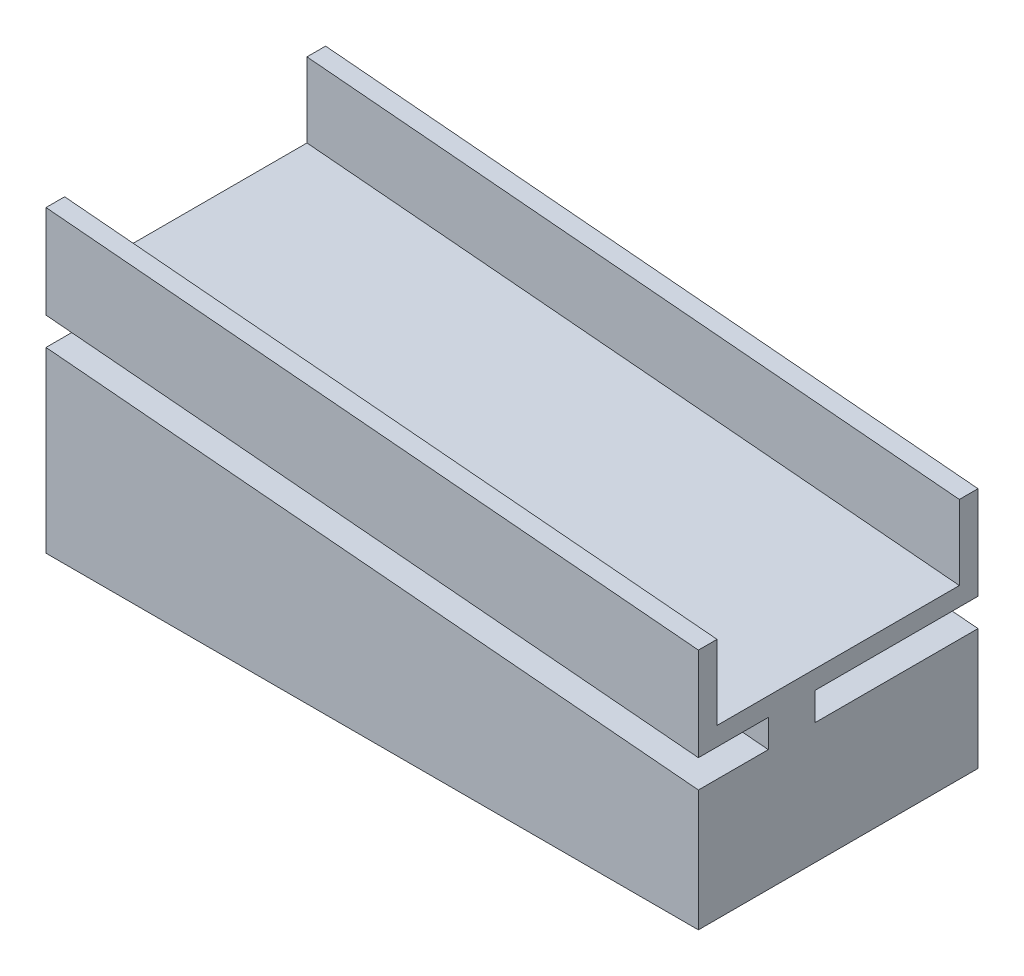
ISO-10303-21;
HEADER;
FILE_DESCRIPTION(('STEP AP214'),'2;1');
FILE_NAME('part.step','',(''),(''),'','','');
FILE_SCHEMA(('AUTOMOTIVE_DESIGN { 1 0 10303 214 1 1 1 1 }'));
ENDSEC;
DATA;
#1=APPLICATION_CONTEXT('core data for automotive mechanical design processes');
#2=APPLICATION_PROTOCOL_DEFINITION('international standard','automotive_design',2000,#1);
#3=PRODUCT_CONTEXT('',#1,'mechanical');
#4=PRODUCT('Part','Part','',(#3));
#5=PRODUCT_RELATED_PRODUCT_CATEGORY('part','',(#4));
#6=PRODUCT_DEFINITION_FORMATION('','',#4);
#7=PRODUCT_DEFINITION_CONTEXT('part definition',#1,'design');
#8=PRODUCT_DEFINITION('design','',#6,#7);
#9=PRODUCT_DEFINITION_SHAPE('','',#8);
#10=(LENGTH_UNIT() NAMED_UNIT(*) SI_UNIT(.MILLI.,.METRE.));
#11=(NAMED_UNIT(*) PLANE_ANGLE_UNIT() SI_UNIT($,.RADIAN.));
#12=(NAMED_UNIT(*) SI_UNIT($,.STERADIAN.) SOLID_ANGLE_UNIT());
#13=UNCERTAINTY_MEASURE_WITH_UNIT(LENGTH_MEASURE(1.E-05),#10,'distance_accuracy_value','');
#14=(GEOMETRIC_REPRESENTATION_CONTEXT(3) GLOBAL_UNCERTAINTY_ASSIGNED_CONTEXT((#13)) GLOBAL_UNIT_ASSIGNED_CONTEXT((#10,
#11,#12)) REPRESENTATION_CONTEXT('',''));
#15=CARTESIAN_POINT('',(0.,0.,0.));
#16=DIRECTION('',(0.,0.,1.));
#17=DIRECTION('',(1.,0.,0.));
#18=AXIS2_PLACEMENT_3D('',#15,#16,#17);
#19=CARTESIAN_POINT('',(0.,19.1242064468142,30.));
#20=DIRECTION('',(-0.0871557427476511,-0.996194698091746,0.));
#21=DIRECTION('',(0.996194698091746,-0.0871557427476511,0.));
#22=AXIS2_PLACEMENT_3D('',#19,#20,#21);
#23=PLANE('',#22);
#24=DIRECTION('',(0.996194698091746,-0.0871557427476511,0.));
#25=VECTOR('',#24,1.);
#26=CARTESIAN_POINT('',(0.,19.1242064468142,17.5));
#27=LINE('',#26,#25);
#28=CARTESIAN_POINT('',(0.,19.1242064468142,17.5));
#29=VERTEX_POINT('',#28);
#30=CARTESIAN_POINT('',(70.,13.,17.5));
#31=VERTEX_POINT('',#30);
#32=EDGE_CURVE('E242',#29,#31,#27,.T.);
#33=ORIENTED_EDGE('',*,*,#32,.T.);
#34=DIRECTION('',(0.,0.,-1.));
#35=VECTOR('',#34,1.);
#36=CARTESIAN_POINT('',(70.,13.,30.));
#37=LINE('',#36,#35);
#38=CARTESIAN_POINT('',(70.,13.,0.));
#39=VERTEX_POINT('',#38);
#40=EDGE_CURVE('E268',#31,#39,#37,.T.);
#41=ORIENTED_EDGE('',*,*,#40,.T.);
#42=DIRECTION('',(-0.996194698091746,0.0871557427476511,0.));
#43=VECTOR('',#42,1.);
#44=CARTESIAN_POINT('',(0.,19.1242064468142,0.));
#45=LINE('',#44,#43);
#46=CARTESIAN_POINT('',(0.,19.1242064468142,0.));
#47=VERTEX_POINT('',#46);
#48=EDGE_CURVE('E261',#39,#47,#45,.T.);
#49=ORIENTED_EDGE('',*,*,#48,.T.);
#50=DIRECTION('',(0.,0.,-1.));
#51=VECTOR('',#50,1.);
#52=CARTESIAN_POINT('',(0.,19.1242064468142,30.));
#53=LINE('',#52,#51);
#54=EDGE_CURVE('E266',#29,#47,#53,.T.);
#55=ORIENTED_EDGE('',*,*,#54,.F.);
#56=EDGE_LOOP('',(#33,#41,#49,#55));
#57=FACE_BOUND('',#56,.T.);
#58=ADVANCED_FACE('F33',(#57),#23,.F.);
#59=CARTESIAN_POINT('',(70.,0.,30.));
#60=DIRECTION('',(0.,1.,0.));
#61=DIRECTION('',(-1.,0.,0.));
#62=AXIS2_PLACEMENT_3D('',#59,#60,#61);
#63=PLANE('',#62);
#64=DIRECTION('',(1.,0.,0.));
#65=VECTOR('',#64,1.);
#66=CARTESIAN_POINT('',(70.,0.,0.));
#67=LINE('',#66,#65);
#68=CARTESIAN_POINT('',(0.,0.,0.));
#69=VERTEX_POINT('',#68);
#70=CARTESIAN_POINT('',(70.,0.,0.));
#71=VERTEX_POINT('',#70);
#72=EDGE_CURVE('E240',#69,#71,#67,.T.);
#73=ORIENTED_EDGE('',*,*,#72,.T.);
#74=DIRECTION('',(0.,0.,-1.));
#75=VECTOR('',#74,1.);
#76=CARTESIAN_POINT('',(70.,0.,30.));
#77=LINE('',#76,#75);
#78=CARTESIAN_POINT('',(70.,0.,30.));
#79=VERTEX_POINT('',#78);
#80=EDGE_CURVE('E11',#79,#71,#77,.T.);
#81=ORIENTED_EDGE('',*,*,#80,.F.);
#82=DIRECTION('',(1.,0.,0.));
#83=VECTOR('',#82,1.);
#84=CARTESIAN_POINT('',(70.,0.,30.));
#85=LINE('',#84,#83);
#86=CARTESIAN_POINT('',(0.,0.,30.));
#87=VERTEX_POINT('',#86);
#88=EDGE_CURVE('E249',#87,#79,#85,.T.);
#89=ORIENTED_EDGE('',*,*,#88,.F.);
#90=DIRECTION('',(0.,0.,-1.));
#91=VECTOR('',#90,1.);
#92=CARTESIAN_POINT('',(0.,0.,30.));
#93=LINE('',#92,#91);
#94=EDGE_CURVE('E255',#87,#69,#93,.T.);
#95=ORIENTED_EDGE('',*,*,#94,.T.);
#96=EDGE_LOOP('',(#73,#81,#89,#95));
#97=FACE_BOUND('',#96,.T.);
#98=ADVANCED_FACE('F35',(#97),#63,.F.);
#99=CARTESIAN_POINT('',(70.,13.,30.));
#100=DIRECTION('',(-1.,0.,0.));
#101=DIRECTION('',(0.,0.,1.));
#102=AXIS2_PLACEMENT_3D('',#99,#100,#101);
#103=PLANE('',#102);
#104=DIRECTION('',(0.,1.,0.));
#105=VECTOR('',#104,1.);
#106=CARTESIAN_POINT('',(70.,13.,0.));
#107=LINE('',#106,#105);
#108=EDGE_CURVE('E258',#71,#39,#107,.T.);
#109=ORIENTED_EDGE('',*,*,#108,.T.);
#110=ORIENTED_EDGE('',*,*,#40,.F.);
#111=DIRECTION('',(0.,1.,0.));
#112=VECTOR('',#111,1.);
#113=CARTESIAN_POINT('',(70.,13.,17.5));
#114=LINE('',#113,#112);
#115=CARTESIAN_POINT('',(70.,16.,17.5));
#116=VERTEX_POINT('',#115);
#117=EDGE_CURVE('E245',#31,#116,#114,.T.);
#118=ORIENTED_EDGE('',*,*,#117,.T.);
#119=DIRECTION('',(0.,0.,1.));
#120=VECTOR('',#119,1.);
#121=CARTESIAN_POINT('',(70.,16.,0.));
#122=LINE('',#121,#120);
#123=CARTESIAN_POINT('',(70.,16.,0.));
#124=VERTEX_POINT('',#123);
#125=EDGE_CURVE('E229',#124,#116,#122,.T.);
#126=ORIENTED_EDGE('',*,*,#125,.F.);
#127=DIRECTION('',(0.,-1.,0.));
#128=VECTOR('',#127,1.);
#129=CARTESIAN_POINT('',(70.,16.,0.));
#130=LINE('',#129,#128);
#131=CARTESIAN_POINT('',(70.,26.,0.));
#132=VERTEX_POINT('',#131);
#133=EDGE_CURVE('E222',#132,#124,#130,.T.);
#134=ORIENTED_EDGE('',*,*,#133,.F.);
#135=DIRECTION('',(0.,0.,-1.));
#136=VECTOR('',#135,1.);
#137=CARTESIAN_POINT('',(70.,26.,0.));
#138=LINE('',#137,#136);
#139=CARTESIAN_POINT('',(70.,26.,2.));
#140=VERTEX_POINT('',#139);
#141=EDGE_CURVE('E215',#140,#132,#138,.T.);
#142=ORIENTED_EDGE('',*,*,#141,.F.);
#143=DIRECTION('',(0.,1.,0.));
#144=VECTOR('',#143,1.);
#145=CARTESIAN_POINT('',(70.,26.,2.));
#146=LINE('',#145,#144);
#147=CARTESIAN_POINT('',(70.,18.,2.));
#148=VERTEX_POINT('',#147);
#149=EDGE_CURVE('E207',#148,#140,#146,.T.);
#150=ORIENTED_EDGE('',*,*,#149,.F.);
#151=DIRECTION('',(0.,0.,-1.));
#152=VECTOR('',#151,1.);
#153=CARTESIAN_POINT('',(70.,18.,2.));
#154=LINE('',#153,#152);
#155=CARTESIAN_POINT('',(70.,18.,28.));
#156=VERTEX_POINT('',#155);
#157=EDGE_CURVE('E199',#156,#148,#154,.T.);
#158=ORIENTED_EDGE('',*,*,#157,.F.);
#159=DIRECTION('',(0.,-1.,0.));
#160=VECTOR('',#159,1.);
#161=CARTESIAN_POINT('',(70.,26.,28.));
#162=LINE('',#161,#160);
#163=CARTESIAN_POINT('',(70.,26.,28.));
#164=VERTEX_POINT('',#163);
#165=EDGE_CURVE('E191',#164,#156,#162,.T.);
#166=ORIENTED_EDGE('',*,*,#165,.F.);
#167=DIRECTION('',(0.,0.,-1.));
#168=VECTOR('',#167,1.);
#169=CARTESIAN_POINT('',(70.,26.,28.));
#170=LINE('',#169,#168);
#171=CARTESIAN_POINT('',(70.,26.,30.));
#172=VERTEX_POINT('',#171);
#173=EDGE_CURVE('E186',#172,#164,#170,.T.);
#174=ORIENTED_EDGE('',*,*,#173,.F.);
#175=DIRECTION('',(0.,1.,0.));
#176=VECTOR('',#175,1.);
#177=CARTESIAN_POINT('',(70.,16.,30.));
#178=LINE('',#177,#176);
#179=CARTESIAN_POINT('',(70.,16.,30.));
#180=VERTEX_POINT('',#179);
#181=EDGE_CURVE('E179',#180,#172,#178,.T.);
#182=ORIENTED_EDGE('',*,*,#181,.F.);
#183=CARTESIAN_POINT('',(70.,16.,22.5));
#184=VERTEX_POINT('',#183);
#185=EDGE_CURVE('E177',#184,#180,#122,.T.);
#186=ORIENTED_EDGE('',*,*,#185,.F.);
#187=DIRECTION('',(0.,1.,0.));
#188=VECTOR('',#187,1.);
#189=CARTESIAN_POINT('',(70.,13.,22.5));
#190=LINE('',#189,#188);
#191=CARTESIAN_POINT('',(70.,13.,22.5));
#192=VERTEX_POINT('',#191);
#193=EDGE_CURVE('E235',#192,#184,#190,.T.);
#194=ORIENTED_EDGE('',*,*,#193,.F.);
#195=CARTESIAN_POINT('',(70.,13.,30.));
#196=VERTEX_POINT('',#195);
#197=EDGE_CURVE('E41',#196,#192,#37,.T.);
#198=ORIENTED_EDGE('',*,*,#197,.F.);
#199=DIRECTION('',(0.,1.,0.));
#200=VECTOR('',#199,1.);
#201=CARTESIAN_POINT('',(70.,13.,30.));
#202=LINE('',#201,#200);
#203=EDGE_CURVE('E82',#79,#196,#202,.T.);
#204=ORIENTED_EDGE('',*,*,#203,.F.);
#205=ORIENTED_EDGE('',*,*,#80,.T.);
#206=EDGE_LOOP('',(#109,#110,#118,#126,#134,#142,#150,#158,#166,#174,#182,#186,#194,#198,#204,#205));
#207=FACE_BOUND('',#206,.T.);
#208=ADVANCED_FACE('F277',(#207),#103,.F.);
#209=ORIENTED_EDGE('',*,*,#197,.T.);
#210=DIRECTION('',(0.996194698091746,-0.0871557427476511,0.));
#211=VECTOR('',#210,1.);
#212=CARTESIAN_POINT('',(0.,19.1242064468142,22.5));
#213=LINE('',#212,#211);
#214=CARTESIAN_POINT('',(0.,19.1242064468142,22.5));
#215=VERTEX_POINT('',#214);
#216=EDGE_CURVE('E232',#215,#192,#213,.T.);
#217=ORIENTED_EDGE('',*,*,#216,.F.);
#218=CARTESIAN_POINT('',(0.,19.1242064468142,30.));
#219=VERTEX_POINT('',#218);
#220=EDGE_CURVE('E267',#219,#215,#53,.T.);
#221=ORIENTED_EDGE('',*,*,#220,.F.);
#222=DIRECTION('',(-0.996194698091746,0.0871557427476511,0.));
#223=VECTOR('',#222,1.);
#224=CARTESIAN_POINT('',(0.,19.1242064468142,30.));
#225=LINE('',#224,#223);
#226=EDGE_CURVE('E252',#196,#219,#225,.T.);
#227=ORIENTED_EDGE('',*,*,#226,.F.);
#228=EDGE_LOOP('',(#209,#217,#221,#227));
#229=FACE_BOUND('',#228,.T.);
#230=ADVANCED_FACE('F285',(#229),#23,.F.);
#231=CARTESIAN_POINT('',(0.,0.,30.));
#232=DIRECTION('',(1.,0.,0.));
#233=DIRECTION('',(0.,1.,0.));
#234=AXIS2_PLACEMENT_3D('',#231,#232,#233);
#235=PLANE('',#234);
#236=DIRECTION('',(0.,-1.,0.));
#237=VECTOR('',#236,1.);
#238=CARTESIAN_POINT('',(0.,0.,0.));
#239=LINE('',#238,#237);
#240=EDGE_CURVE('E75',#47,#69,#239,.T.);
#241=ORIENTED_EDGE('',*,*,#240,.T.);
#242=ORIENTED_EDGE('',*,*,#94,.F.);
#243=DIRECTION('',(0.,-1.,0.));
#244=VECTOR('',#243,1.);
#245=CARTESIAN_POINT('',(0.,0.,30.));
#246=LINE('',#245,#244);
#247=EDGE_CURVE('E57',#219,#87,#246,.T.);
#248=ORIENTED_EDGE('',*,*,#247,.F.);
#249=ORIENTED_EDGE('',*,*,#220,.T.);
#250=DIRECTION('',(0.,-1.,0.));
#251=VECTOR('',#250,1.);
#252=CARTESIAN_POINT('',(0.,22.1242064468142,22.5));
#253=LINE('',#252,#251);
#254=CARTESIAN_POINT('',(0.,22.1242064468142,22.5));
#255=VERTEX_POINT('',#254);
#256=EDGE_CURVE('E160',#255,#215,#253,.T.);
#257=ORIENTED_EDGE('',*,*,#256,.F.);
#258=DIRECTION('',(0.,0.,1.));
#259=VECTOR('',#258,1.);
#260=CARTESIAN_POINT('',(0.,22.1242064468142,0.));
#261=LINE('',#260,#259);
#262=CARTESIAN_POINT('',(0.,22.1242064468142,30.));
#263=VERTEX_POINT('',#262);
#264=EDGE_CURVE('E153',#255,#263,#261,.T.);
#265=ORIENTED_EDGE('',*,*,#264,.T.);
#266=DIRECTION('',(0.,1.,0.));
#267=VECTOR('',#266,1.);
#268=CARTESIAN_POINT('',(0.,22.1242064468142,30.));
#269=LINE('',#268,#267);
#270=CARTESIAN_POINT('',(0.,32.1242064468142,30.));
#271=VERTEX_POINT('',#270);
#272=EDGE_CURVE('E157',#263,#271,#269,.T.);
#273=ORIENTED_EDGE('',*,*,#272,.T.);
#274=DIRECTION('',(0.,0.,-1.));
#275=VECTOR('',#274,1.);
#276=CARTESIAN_POINT('',(0.,32.1242064468142,28.));
#277=LINE('',#276,#275);
#278=CARTESIAN_POINT('',(0.,32.1242064468142,28.));
#279=VERTEX_POINT('',#278);
#280=EDGE_CURVE('E173',#271,#279,#277,.T.);
#281=ORIENTED_EDGE('',*,*,#280,.T.);
#282=DIRECTION('',(0.,-1.,0.));
#283=VECTOR('',#282,1.);
#284=CARTESIAN_POINT('',(0.,32.1242064468142,28.));
#285=LINE('',#284,#283);
#286=CARTESIAN_POINT('',(0.,24.1242064468142,28.));
#287=VERTEX_POINT('',#286);
#288=EDGE_CURVE('E185',#279,#287,#285,.T.);
#289=ORIENTED_EDGE('',*,*,#288,.T.);
#290=DIRECTION('',(0.,0.,-1.));
#291=VECTOR('',#290,1.);
#292=CARTESIAN_POINT('',(0.,24.1242064468142,2.));
#293=LINE('',#292,#291);
#294=CARTESIAN_POINT('',(0.,24.1242064468142,2.));
#295=VERTEX_POINT('',#294);
#296=EDGE_CURVE('E194',#287,#295,#293,.T.);
#297=ORIENTED_EDGE('',*,*,#296,.T.);
#298=DIRECTION('',(0.,1.,0.));
#299=VECTOR('',#298,1.);
#300=CARTESIAN_POINT('',(0.,32.1242064468142,2.));
#301=LINE('',#300,#299);
#302=CARTESIAN_POINT('',(0.,32.1242064468142,2.));
#303=VERTEX_POINT('',#302);
#304=EDGE_CURVE('E202',#295,#303,#301,.T.);
#305=ORIENTED_EDGE('',*,*,#304,.T.);
#306=DIRECTION('',(0.,0.,-1.));
#307=VECTOR('',#306,1.);
#308=CARTESIAN_POINT('',(0.,32.1242064468142,0.));
#309=LINE('',#308,#307);
#310=CARTESIAN_POINT('',(0.,32.1242064468142,0.));
#311=VERTEX_POINT('',#310);
#312=EDGE_CURVE('E210',#303,#311,#309,.T.);
#313=ORIENTED_EDGE('',*,*,#312,.T.);
#314=DIRECTION('',(0.,-1.,0.));
#315=VECTOR('',#314,1.);
#316=CARTESIAN_POINT('',(0.,22.1242064468142,0.));
#317=LINE('',#316,#315);
#318=CARTESIAN_POINT('',(0.,22.1242064468142,0.));
#319=VERTEX_POINT('',#318);
#320=EDGE_CURVE('E165',#311,#319,#317,.T.);
#321=ORIENTED_EDGE('',*,*,#320,.T.);
#322=CARTESIAN_POINT('',(0.,22.1242064468142,17.5));
#323=VERTEX_POINT('',#322);
#324=EDGE_CURVE('E164',#319,#323,#261,.T.);
#325=ORIENTED_EDGE('',*,*,#324,.T.);
#326=DIRECTION('',(0.,-1.,0.));
#327=VECTOR('',#326,1.);
#328=CARTESIAN_POINT('',(0.,22.1242064468142,17.5));
#329=LINE('',#328,#327);
#330=EDGE_CURVE('E48',#323,#29,#329,.T.);
#331=ORIENTED_EDGE('',*,*,#330,.T.);
#332=ORIENTED_EDGE('',*,*,#54,.T.);
#333=EDGE_LOOP('',(#241,#242,#248,#249,#257,#265,#273,#281,#289,#297,#305,#313,#321,#325,#331,#332));
#334=FACE_BOUND('',#333,.T.);
#335=ADVANCED_FACE('F155',(#334),#235,.F.);
#336=CARTESIAN_POINT('',(0.,0.,30.));
#337=DIRECTION('',(0.,0.,-1.));
#338=DIRECTION('',(-1.,0.,0.));
#339=AXIS2_PLACEMENT_3D('',#336,#337,#338);
#340=PLANE('',#339);
#341=ORIENTED_EDGE('',*,*,#88,.T.);
#342=ORIENTED_EDGE('',*,*,#203,.T.);
#343=ORIENTED_EDGE('',*,*,#226,.T.);
#344=ORIENTED_EDGE('',*,*,#247,.T.);
#345=EDGE_LOOP('',(#341,#342,#343,#344));
#346=FACE_BOUND('',#345,.T.);
#347=ADVANCED_FACE('F339',(#346),#340,.F.);
#348=CARTESIAN_POINT('',(0.,0.,0.));
#349=DIRECTION('',(0.,0.,-1.));
#350=DIRECTION('',(-1.,0.,0.));
#351=AXIS2_PLACEMENT_3D('',#348,#349,#350);
#352=PLANE('',#351);
#353=ORIENTED_EDGE('',*,*,#72,.F.);
#354=ORIENTED_EDGE('',*,*,#240,.F.);
#355=ORIENTED_EDGE('',*,*,#48,.F.);
#356=ORIENTED_EDGE('',*,*,#108,.F.);
#357=EDGE_LOOP('',(#353,#354,#355,#356));
#358=FACE_BOUND('',#357,.T.);
#359=ADVANCED_FACE('F281',(#358),#352,.T.);
#360=CARTESIAN_POINT('',(0.,0.,22.5));
#361=DIRECTION('',(0.,0.,1.));
#362=DIRECTION('',(1.,0.,0.));
#363=AXIS2_PLACEMENT_3D('',#360,#361,#362);
#364=PLANE('',#363);
#365=ORIENTED_EDGE('',*,*,#256,.T.);
#366=ORIENTED_EDGE('',*,*,#216,.T.);
#367=ORIENTED_EDGE('',*,*,#193,.T.);
#368=DIRECTION('',(-0.996194698091746,0.087155742747651,0.));
#369=VECTOR('',#368,1.);
#370=CARTESIAN_POINT('',(70.,16.,22.5));
#371=LINE('',#370,#369);
#372=EDGE_CURVE('E238',#184,#255,#371,.T.);
#373=ORIENTED_EDGE('',*,*,#372,.T.);
#374=EDGE_LOOP('',(#365,#366,#367,#373));
#375=FACE_BOUND('',#374,.T.);
#376=ADVANCED_FACE('F288',(#375),#364,.T.);
#377=CARTESIAN_POINT('',(0.,0.,17.5));
#378=DIRECTION('',(0.,0.,1.));
#379=DIRECTION('',(1.,0.,0.));
#380=AXIS2_PLACEMENT_3D('',#377,#378,#379);
#381=PLANE('',#380);
#382=ORIENTED_EDGE('',*,*,#330,.F.);
#383=DIRECTION('',(-0.996194698091746,0.087155742747651,0.));
#384=VECTOR('',#383,1.);
#385=CARTESIAN_POINT('',(70.,16.,17.5));
#386=LINE('',#385,#384);
#387=EDGE_CURVE('E233',#116,#323,#386,.T.);
#388=ORIENTED_EDGE('',*,*,#387,.F.);
#389=ORIENTED_EDGE('',*,*,#117,.F.);
#390=ORIENTED_EDGE('',*,*,#32,.F.);
#391=EDGE_LOOP('',(#382,#388,#389,#390));
#392=FACE_BOUND('',#391,.T.);
#393=ADVANCED_FACE('F318',(#392),#381,.F.);
#394=CARTESIAN_POINT('',(0.,22.1242064468142,0.));
#395=DIRECTION('',(0.087155742747651,0.996194698091746,0.));
#396=DIRECTION('',(-0.996194698091746,0.087155742747651,0.));
#397=AXIS2_PLACEMENT_3D('',#394,#395,#396);
#398=PLANE('',#397);
#399=ORIENTED_EDGE('',*,*,#125,.T.);
#400=ORIENTED_EDGE('',*,*,#387,.T.);
#401=ORIENTED_EDGE('',*,*,#324,.F.);
#402=DIRECTION('',(0.996194698091746,-0.087155742747651,0.));
#403=VECTOR('',#402,1.);
#404=CARTESIAN_POINT('',(0.,22.1242064468142,0.));
#405=LINE('',#404,#403);
#406=EDGE_CURVE('E226',#319,#124,#405,.T.);
#407=ORIENTED_EDGE('',*,*,#406,.T.);
#408=EDGE_LOOP('',(#399,#400,#401,#407));
#409=FACE_BOUND('',#408,.T.);
#410=ADVANCED_FACE('F315',(#409),#398,.F.);
#411=CARTESIAN_POINT('',(0.,22.1242064468142,30.));
#412=DIRECTION('',(0.,0.,-1.));
#413=DIRECTION('',(-1.,0.,0.));
#414=AXIS2_PLACEMENT_3D('',#411,#412,#413);
#415=PLANE('',#414);
#416=DIRECTION('',(0.996194698091746,-0.087155742747651,0.));
#417=VECTOR('',#416,1.);
#418=CARTESIAN_POINT('',(0.,32.1242064468142,30.));
#419=LINE('',#418,#417);
#420=EDGE_CURVE('E172',#271,#172,#419,.T.);
#421=ORIENTED_EDGE('',*,*,#420,.F.);
#422=ORIENTED_EDGE('',*,*,#272,.F.);
#423=DIRECTION('',(0.996194698091746,-0.087155742747651,0.));
#424=VECTOR('',#423,1.);
#425=CARTESIAN_POINT('',(0.,22.1242064468142,30.));
#426=LINE('',#425,#424);
#427=EDGE_CURVE('E170',#263,#180,#426,.T.);
#428=ORIENTED_EDGE('',*,*,#427,.T.);
#429=ORIENTED_EDGE('',*,*,#181,.T.);
#430=EDGE_LOOP('',(#421,#422,#428,#429));
#431=FACE_BOUND('',#430,.T.);
#432=ADVANCED_FACE('F169',(#431),#415,.F.);
#433=CARTESIAN_POINT('',(0.,32.1242064468142,28.));
#434=DIRECTION('',(-0.087155742747651,-0.996194698091746,0.));
#435=DIRECTION('',(0.996194698091746,-0.087155742747651,0.));
#436=AXIS2_PLACEMENT_3D('',#433,#434,#435);
#437=PLANE('',#436);
#438=DIRECTION('',(0.996194698091746,-0.087155742747651,0.));
#439=VECTOR('',#438,1.);
#440=CARTESIAN_POINT('',(0.,32.1242064468142,28.));
#441=LINE('',#440,#439);
#442=EDGE_CURVE('E188',#279,#164,#441,.T.);
#443=ORIENTED_EDGE('',*,*,#442,.F.);
#444=ORIENTED_EDGE('',*,*,#280,.F.);
#445=ORIENTED_EDGE('',*,*,#420,.T.);
#446=ORIENTED_EDGE('',*,*,#173,.T.);
#447=EDGE_LOOP('',(#443,#444,#445,#446));
#448=FACE_BOUND('',#447,.T.);
#449=ADVANCED_FACE('F294',(#448),#437,.F.);
#450=CARTESIAN_POINT('',(0.,32.1242064468142,28.));
#451=DIRECTION('',(0.,0.,1.));
#452=DIRECTION('',(1.,0.,0.));
#453=AXIS2_PLACEMENT_3D('',#450,#451,#452);
#454=PLANE('',#453);
#455=DIRECTION('',(0.996194698091746,-0.087155742747651,0.));
#456=VECTOR('',#455,1.);
#457=CARTESIAN_POINT('',(0.,24.1242064468142,28.));
#458=LINE('',#457,#456);
#459=EDGE_CURVE('E196',#287,#156,#458,.T.);
#460=ORIENTED_EDGE('',*,*,#459,.F.);
#461=ORIENTED_EDGE('',*,*,#288,.F.);
#462=ORIENTED_EDGE('',*,*,#442,.T.);
#463=ORIENTED_EDGE('',*,*,#165,.T.);
#464=EDGE_LOOP('',(#460,#461,#462,#463));
#465=FACE_BOUND('',#464,.T.);
#466=ADVANCED_FACE('F298',(#465),#454,.F.);
#467=CARTESIAN_POINT('',(0.,24.1242064468142,2.));
#468=DIRECTION('',(-0.087155742747651,-0.996194698091746,0.));
#469=DIRECTION('',(0.996194698091746,-0.087155742747651,0.));
#470=AXIS2_PLACEMENT_3D('',#467,#468,#469);
#471=PLANE('',#470);
#472=DIRECTION('',(0.996194698091746,-0.087155742747651,0.));
#473=VECTOR('',#472,1.);
#474=CARTESIAN_POINT('',(0.,24.1242064468142,2.));
#475=LINE('',#474,#473);
#476=EDGE_CURVE('E204',#295,#148,#475,.T.);
#477=ORIENTED_EDGE('',*,*,#476,.F.);
#478=ORIENTED_EDGE('',*,*,#296,.F.);
#479=ORIENTED_EDGE('',*,*,#459,.T.);
#480=ORIENTED_EDGE('',*,*,#157,.T.);
#481=EDGE_LOOP('',(#477,#478,#479,#480));
#482=FACE_BOUND('',#481,.T.);
#483=ADVANCED_FACE('F300',(#482),#471,.F.);
#484=CARTESIAN_POINT('',(0.,32.1242064468142,2.));
#485=DIRECTION('',(0.,0.,-1.));
#486=DIRECTION('',(0.,1.,0.));
#487=AXIS2_PLACEMENT_3D('',#484,#485,#486);
#488=PLANE('',#487);
#489=DIRECTION('',(0.996194698091746,-0.087155742747651,0.));
#490=VECTOR('',#489,1.);
#491=CARTESIAN_POINT('',(0.,32.1242064468142,2.));
#492=LINE('',#491,#490);
#493=EDGE_CURVE('E212',#303,#140,#492,.T.);
#494=ORIENTED_EDGE('',*,*,#493,.F.);
#495=ORIENTED_EDGE('',*,*,#304,.F.);
#496=ORIENTED_EDGE('',*,*,#476,.T.);
#497=ORIENTED_EDGE('',*,*,#149,.T.);
#498=EDGE_LOOP('',(#494,#495,#496,#497));
#499=FACE_BOUND('',#498,.T.);
#500=ADVANCED_FACE('F304',(#499),#488,.F.);
#501=CARTESIAN_POINT('',(0.,32.1242064468142,0.));
#502=DIRECTION('',(-0.087155742747651,-0.996194698091746,0.));
#503=DIRECTION('',(0.996194698091746,-0.087155742747651,0.));
#504=AXIS2_PLACEMENT_3D('',#501,#502,#503);
#505=PLANE('',#504);
#506=DIRECTION('',(0.996194698091746,-0.087155742747651,0.));
#507=VECTOR('',#506,1.);
#508=CARTESIAN_POINT('',(0.,32.1242064468142,0.));
#509=LINE('',#508,#507);
#510=EDGE_CURVE('E219',#311,#132,#509,.T.);
#511=ORIENTED_EDGE('',*,*,#510,.F.);
#512=ORIENTED_EDGE('',*,*,#312,.F.);
#513=ORIENTED_EDGE('',*,*,#493,.T.);
#514=ORIENTED_EDGE('',*,*,#141,.T.);
#515=EDGE_LOOP('',(#511,#512,#513,#514));
#516=FACE_BOUND('',#515,.T.);
#517=ADVANCED_FACE('F309',(#516),#505,.F.);
#518=CARTESIAN_POINT('',(0.,22.1242064468142,0.));
#519=DIRECTION('',(0.,0.,1.));
#520=DIRECTION('',(1.,0.,0.));
#521=AXIS2_PLACEMENT_3D('',#518,#519,#520);
#522=PLANE('',#521);
#523=ORIENTED_EDGE('',*,*,#406,.F.);
#524=ORIENTED_EDGE('',*,*,#320,.F.);
#525=ORIENTED_EDGE('',*,*,#510,.T.);
#526=ORIENTED_EDGE('',*,*,#133,.T.);
#527=EDGE_LOOP('',(#523,#524,#525,#526));
#528=FACE_BOUND('',#527,.T.);
#529=ADVANCED_FACE('F312',(#528),#522,.F.);
#530=ORIENTED_EDGE('',*,*,#372,.F.);
#531=ORIENTED_EDGE('',*,*,#185,.T.);
#532=ORIENTED_EDGE('',*,*,#427,.F.);
#533=ORIENTED_EDGE('',*,*,#264,.F.);
#534=EDGE_LOOP('',(#530,#531,#532,#533));
#535=FACE_BOUND('',#534,.T.);
#536=ADVANCED_FACE('F175',(#535),#398,.F.);
#537=CLOSED_SHELL('',(#58,#98,#208,#230,#335,#347,#359,#376,#393,#410,#432,#449,#466,#483,#500,
#517,#529,#536));
#538=MANIFOLD_SOLID_BREP('B2',#537);
#539=ADVANCED_BREP_SHAPE_REPRESENTATION('',(#18,#538),#14);
#540=SHAPE_DEFINITION_REPRESENTATION(#9,#539);
ENDSEC;
END-ISO-10303-21;
